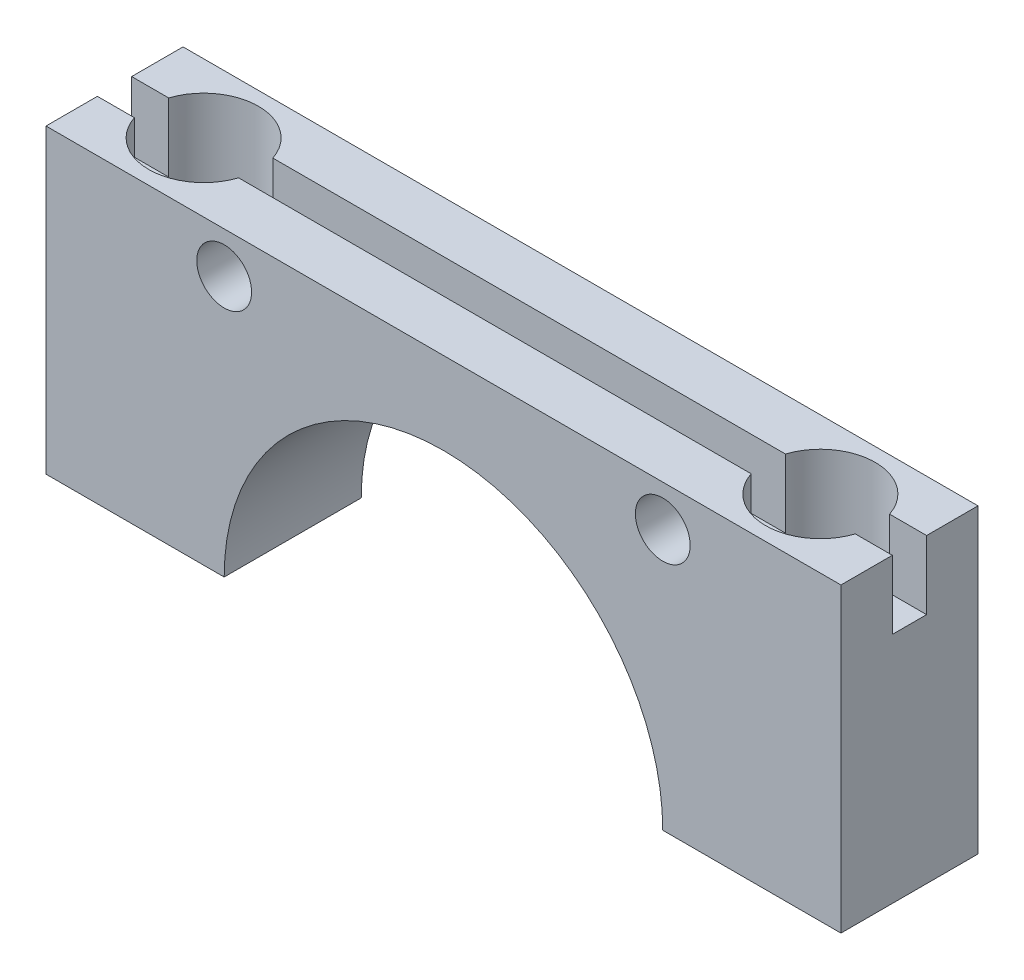
ISO-10303-21;
HEADER;
FILE_DESCRIPTION(('STEP AP214'),'2;1');
FILE_NAME('part.step','',(''),(''),'','','');
FILE_SCHEMA(('AUTOMOTIVE_DESIGN { 1 0 10303 214 1 1 1 1 }'));
ENDSEC;
DATA;
#1=APPLICATION_CONTEXT('core data for automotive mechanical design processes');
#2=APPLICATION_PROTOCOL_DEFINITION('international standard','automotive_design',2000,#1);
#3=PRODUCT_CONTEXT('',#1,'mechanical');
#4=PRODUCT('Part','Part','',(#3));
#5=PRODUCT_RELATED_PRODUCT_CATEGORY('part','',(#4));
#6=PRODUCT_DEFINITION_FORMATION('','',#4);
#7=PRODUCT_DEFINITION_CONTEXT('part definition',#1,'design');
#8=PRODUCT_DEFINITION('design','',#6,#7);
#9=PRODUCT_DEFINITION_SHAPE('','',#8);
#10=(LENGTH_UNIT() NAMED_UNIT(*) SI_UNIT(.MILLI.,.METRE.));
#11=(NAMED_UNIT(*) PLANE_ANGLE_UNIT() SI_UNIT($,.RADIAN.));
#12=(NAMED_UNIT(*) SI_UNIT($,.STERADIAN.) SOLID_ANGLE_UNIT());
#13=UNCERTAINTY_MEASURE_WITH_UNIT(LENGTH_MEASURE(1.E-05),#10,'distance_accuracy_value','');
#14=(GEOMETRIC_REPRESENTATION_CONTEXT(3) GLOBAL_UNCERTAINTY_ASSIGNED_CONTEXT((#13)) GLOBAL_UNIT_ASSIGNED_CONTEXT((#10,
#11,#12)) REPRESENTATION_CONTEXT('',''));
#15=CARTESIAN_POINT('',(0.,0.,0.));
#16=DIRECTION('',(0.,0.,1.));
#17=DIRECTION('',(1.,0.,0.));
#18=AXIS2_PLACEMENT_3D('',#15,#16,#17);
#19=CARTESIAN_POINT('',(-69.3342781396671,28.5744667064877,10.));
#20=DIRECTION('',(0.,-1.,0.));
#21=DIRECTION('',(0.,0.,-1.));
#22=AXIS2_PLACEMENT_3D('',#19,#20,#21);
#23=PLANE('',#22);
#24=DIRECTION('',(0.,0.,-1.));
#25=VECTOR('',#24,1.);
#26=CARTESIAN_POINT('',(-69.3342781396671,28.5744667064877,10.));
#27=LINE('',#26,#25);
#28=CARTESIAN_POINT('',(-69.3342781396671,28.5744667064877,3.75));
#29=VERTEX_POINT('',#28);
#30=CARTESIAN_POINT('',(-69.3342781396671,28.5744667064877,0.));
#31=VERTEX_POINT('',#30);
#32=EDGE_CURVE('E320',#29,#31,#27,.T.);
#33=ORIENTED_EDGE('',*,*,#32,.F.);
#34=DIRECTION('',(-1.,0.,0.));
#35=VECTOR('',#34,1.);
#36=CARTESIAN_POINT('',(-69.3342781396671,28.5744667064877,3.75));
#37=LINE('',#36,#35);
#38=CARTESIAN_POINT('',(-66.6339491780598,28.5744667064877,3.75));
#39=VERTEX_POINT('',#38);
#40=EDGE_CURVE('E365',#39,#29,#37,.T.);
#41=ORIENTED_EDGE('',*,*,#40,.F.);
#42=CARTESIAN_POINT('',(-62.8342781396671,28.5744667064877,5.));
#43=DIRECTION('',(0.,1.,0.));
#44=DIRECTION('',(0.,0.,1.));
#45=AXIS2_PLACEMENT_3D('',#42,#43,#44);
#46=CIRCLE('',#45,4.00000000000001);
#47=CARTESIAN_POINT('',(-59.0346071012744,28.5744667064877,3.75));
#48=VERTEX_POINT('',#47);
#49=EDGE_CURVE('E238',#48,#39,#46,.T.);
#50=ORIENTED_EDGE('',*,*,#49,.F.);
#51=CARTESIAN_POINT('',(-21.6339491780598,28.5744667064877,3.75));
#52=VERTEX_POINT('',#51);
#53=EDGE_CURVE('E369',#52,#48,#37,.T.);
#54=ORIENTED_EDGE('',*,*,#53,.F.);
#55=CARTESIAN_POINT('',(-17.8342781396671,28.5744667064877,5.));
#56=DIRECTION('',(0.,1.,0.));
#57=DIRECTION('',(0.,0.,1.));
#58=AXIS2_PLACEMENT_3D('',#55,#56,#57);
#59=CIRCLE('',#58,4.);
#60=CARTESIAN_POINT('',(-14.0346071012744,28.5744667064877,3.75));
#61=VERTEX_POINT('',#60);
#62=EDGE_CURVE('E247',#61,#52,#59,.T.);
#63=ORIENTED_EDGE('',*,*,#62,.F.);
#64=CARTESIAN_POINT('',(-11.3342781396671,28.5744667064877,3.75));
#65=VERTEX_POINT('',#64);
#66=EDGE_CURVE('E194',#65,#61,#37,.T.);
#67=ORIENTED_EDGE('',*,*,#66,.F.);
#68=DIRECTION('',(0.,0.,-1.));
#69=VECTOR('',#68,1.);
#70=CARTESIAN_POINT('',(-11.3342781396671,28.5744667064877,10.));
#71=LINE('',#70,#69);
#72=CARTESIAN_POINT('',(-11.3342781396671,28.5744667064877,0.));
#73=VERTEX_POINT('',#72);
#74=EDGE_CURVE('E281',#65,#73,#71,.T.);
#75=ORIENTED_EDGE('',*,*,#74,.T.);
#76=DIRECTION('',(-1.,0.,0.));
#77=VECTOR('',#76,1.);
#78=CARTESIAN_POINT('',(-69.3342781396671,28.5744667064877,0.));
#79=LINE('',#78,#77);
#80=EDGE_CURVE('E255',#73,#31,#79,.T.);
#81=ORIENTED_EDGE('',*,*,#80,.T.);
#82=EDGE_LOOP('',(#33,#41,#50,#54,#63,#67,#75,#81));
#83=FACE_BOUND('',#82,.T.);
#84=ADVANCED_FACE('F39',(#83),#23,.F.);
#85=CARTESIAN_POINT('',(-17.8342781396671,33.5744667064877,5.));
#86=DIRECTION('',(0.,-1.,0.));
#87=DIRECTION('',(0.,0.,-1.));
#88=AXIS2_PLACEMENT_3D('',#85,#86,#87);
#89=CYLINDRICAL_SURFACE('',#88,1.88);
#90=CARTESIAN_POINT('',(-17.8342781396671,6.57446670648769,5.));
#91=DIRECTION('',(0.,-1.,0.));
#92=DIRECTION('',(0.,0.,-1.));
#93=AXIS2_PLACEMENT_3D('',#90,#91,#92);
#94=CIRCLE('',#93,1.88);
#95=CARTESIAN_POINT('',(-17.8342781396671,6.57446670648769,3.12));
#96=VERTEX_POINT('',#95);
#97=EDGE_CURVE('E256',#96,#96,#94,.T.);
#98=ORIENTED_EDGE('',*,*,#97,.T.);
#99=EDGE_LOOP('',(#98));
#100=FACE_BOUND('',#99,.T.);
#101=CARTESIAN_POINT('',(-17.8342781396671,13.5744667064877,5.));
#102=DIRECTION('',(0.,1.,0.));
#103=DIRECTION('',(0.,0.,1.));
#104=AXIS2_PLACEMENT_3D('',#101,#102,#103);
#105=CIRCLE('',#104,1.88);
#106=CARTESIAN_POINT('',(-17.8342781396671,13.5744667064877,6.88));
#107=VERTEX_POINT('',#106);
#108=EDGE_CURVE('E260',#107,#107,#105,.F.);
#109=ORIENTED_EDGE('',*,*,#108,.F.);
#110=EDGE_LOOP('',(#109));
#111=FACE_BOUND('',#110,.T.);
#112=ADVANCED_FACE('F474',(#100,#111),#89,.F.);
#113=CARTESIAN_POINT('',(-62.8342781396671,33.5744667064877,5.));
#114=DIRECTION('',(0.,-1.,0.));
#115=DIRECTION('',(0.,0.,-1.));
#116=AXIS2_PLACEMENT_3D('',#113,#114,#115);
#117=CYLINDRICAL_SURFACE('',#116,1.8);
#118=CARTESIAN_POINT('',(-62.8342781396671,6.57446670648769,5.));
#119=DIRECTION('',(0.,-1.,0.));
#120=DIRECTION('',(0.,0.,-1.));
#121=AXIS2_PLACEMENT_3D('',#118,#119,#120);
#122=CIRCLE('',#121,1.8);
#123=CARTESIAN_POINT('',(-62.8342781396671,6.57446670648769,3.2));
#124=VERTEX_POINT('',#123);
#125=EDGE_CURVE('E251',#124,#124,#122,.T.);
#126=ORIENTED_EDGE('',*,*,#125,.T.);
#127=EDGE_LOOP('',(#126));
#128=FACE_BOUND('',#127,.T.);
#129=CARTESIAN_POINT('',(-62.8342781396671,13.5744667064877,5.));
#130=DIRECTION('',(0.,1.,0.));
#131=DIRECTION('',(0.,0.,1.));
#132=AXIS2_PLACEMENT_3D('',#129,#130,#131);
#133=CIRCLE('',#132,1.8);
#134=CARTESIAN_POINT('',(-62.8342781396671,13.5744667064877,6.8));
#135=VERTEX_POINT('',#134);
#136=EDGE_CURVE('E237',#135,#135,#133,.F.);
#137=ORIENTED_EDGE('',*,*,#136,.F.);
#138=EDGE_LOOP('',(#137));
#139=FACE_BOUND('',#138,.T.);
#140=ADVANCED_FACE('F478',(#128,#139),#117,.F.);
#141=CARTESIAN_POINT('',(-11.3342781396671,28.5744667064877,10.));
#142=VERTEX_POINT('',#141);
#143=CARTESIAN_POINT('',(-11.3342781396671,28.5744667064877,6.25));
#144=VERTEX_POINT('',#143);
#145=EDGE_CURVE('E300',#142,#144,#71,.T.);
#146=ORIENTED_EDGE('',*,*,#145,.T.);
#147=DIRECTION('',(1.,0.,0.));
#148=VECTOR('',#147,1.);
#149=CARTESIAN_POINT('',(-69.3342781396671,28.5744667064877,6.25));
#150=LINE('',#149,#148);
#151=CARTESIAN_POINT('',(-14.0346071012744,28.5744667064877,6.25));
#152=VERTEX_POINT('',#151);
#153=EDGE_CURVE('E350',#152,#144,#150,.T.);
#154=ORIENTED_EDGE('',*,*,#153,.F.);
#155=CARTESIAN_POINT('',(-21.6339491780598,28.5744667064877,6.25));
#156=VERTEX_POINT('',#155);
#157=EDGE_CURVE('E232',#156,#152,#59,.T.);
#158=ORIENTED_EDGE('',*,*,#157,.F.);
#159=CARTESIAN_POINT('',(-59.0346071012744,28.5744667064877,6.25));
#160=VERTEX_POINT('',#159);
#161=EDGE_CURVE('E366',#160,#156,#150,.T.);
#162=ORIENTED_EDGE('',*,*,#161,.F.);
#163=CARTESIAN_POINT('',(-66.6339491780598,28.5744667064877,6.25));
#164=VERTEX_POINT('',#163);
#165=EDGE_CURVE('E239',#164,#160,#46,.T.);
#166=ORIENTED_EDGE('',*,*,#165,.F.);
#167=CARTESIAN_POINT('',(-69.3342781396671,28.5744667064877,6.25));
#168=VERTEX_POINT('',#167);
#169=EDGE_CURVE('E362',#168,#164,#150,.T.);
#170=ORIENTED_EDGE('',*,*,#169,.F.);
#171=CARTESIAN_POINT('',(-69.3342781396671,28.5744667064877,10.));
#172=VERTEX_POINT('',#171);
#173=EDGE_CURVE('E199',#172,#168,#27,.T.);
#174=ORIENTED_EDGE('',*,*,#173,.F.);
#175=DIRECTION('',(-1.,0.,0.));
#176=VECTOR('',#175,1.);
#177=CARTESIAN_POINT('',(-69.3342781396671,28.5744667064877,10.));
#178=LINE('',#177,#176);
#179=EDGE_CURVE('E261',#142,#172,#178,.T.);
#180=ORIENTED_EDGE('',*,*,#179,.F.);
#181=EDGE_LOOP('',(#146,#154,#158,#162,#166,#170,#174,#180));
#182=FACE_BOUND('',#181,.T.);
#183=ADVANCED_FACE('F41',(#182),#23,.F.);
#184=CARTESIAN_POINT('',(-69.3342781396671,6.57446670648769,10.));
#185=DIRECTION('',(1.,0.,0.));
#186=DIRECTION('',(0.,0.,-1.));
#187=AXIS2_PLACEMENT_3D('',#184,#185,#186);
#188=PLANE('',#187);
#189=DIRECTION('',(0.,0.,1.));
#190=VECTOR('',#189,1.);
#191=CARTESIAN_POINT('',(-69.3342781396671,23.5744667064877,3.75));
#192=LINE('',#191,#190);
#193=CARTESIAN_POINT('',(-69.3342781396671,23.5744667064877,3.75));
#194=VERTEX_POINT('',#193);
#195=CARTESIAN_POINT('',(-69.3342781396671,23.5744667064877,6.25));
#196=VERTEX_POINT('',#195);
#197=EDGE_CURVE('E185',#194,#196,#192,.T.);
#198=ORIENTED_EDGE('',*,*,#197,.F.);
#199=DIRECTION('',(0.,1.,0.));
#200=VECTOR('',#199,1.);
#201=CARTESIAN_POINT('',(-69.3342781396671,23.5744667064877,3.75));
#202=LINE('',#201,#200);
#203=EDGE_CURVE('E217',#194,#29,#202,.T.);
#204=ORIENTED_EDGE('',*,*,#203,.T.);
#205=ORIENTED_EDGE('',*,*,#32,.T.);
#206=DIRECTION('',(0.,-1.,0.));
#207=VECTOR('',#206,1.);
#208=CARTESIAN_POINT('',(-69.3342781396671,6.57446670648769,0.));
#209=LINE('',#208,#207);
#210=CARTESIAN_POINT('',(-69.3342781396671,6.57446670648769,0.));
#211=VERTEX_POINT('',#210);
#212=EDGE_CURVE('E285',#31,#211,#209,.T.);
#213=ORIENTED_EDGE('',*,*,#212,.T.);
#214=DIRECTION('',(0.,0.,-1.));
#215=VECTOR('',#214,1.);
#216=CARTESIAN_POINT('',(-69.3342781396671,6.57446670648769,10.));
#217=LINE('',#216,#215);
#218=CARTESIAN_POINT('',(-69.3342781396671,6.57446670648769,10.));
#219=VERTEX_POINT('',#218);
#220=EDGE_CURVE('E316',#219,#211,#217,.T.);
#221=ORIENTED_EDGE('',*,*,#220,.F.);
#222=DIRECTION('',(0.,-1.,0.));
#223=VECTOR('',#222,1.);
#224=CARTESIAN_POINT('',(-69.3342781396671,6.57446670648769,10.));
#225=LINE('',#224,#223);
#226=EDGE_CURVE('E265',#172,#219,#225,.T.);
#227=ORIENTED_EDGE('',*,*,#226,.F.);
#228=ORIENTED_EDGE('',*,*,#173,.T.);
#229=DIRECTION('',(0.,1.,0.));
#230=VECTOR('',#229,1.);
#231=CARTESIAN_POINT('',(-69.3342781396671,23.5744667064877,6.25));
#232=LINE('',#231,#230);
#233=EDGE_CURVE('E173',#196,#168,#232,.T.);
#234=ORIENTED_EDGE('',*,*,#233,.F.);
#235=EDGE_LOOP('',(#198,#204,#205,#213,#221,#227,#228,#234));
#236=FACE_BOUND('',#235,.T.);
#237=ADVANCED_FACE('F197',(#236),#188,.F.);
#238=CARTESIAN_POINT('',(-69.3342781396671,6.57446670648769,10.));
#239=DIRECTION('',(0.,1.,0.));
#240=DIRECTION('',(0.,0.,1.));
#241=AXIS2_PLACEMENT_3D('',#238,#239,#240);
#242=PLANE('',#241);
#243=ORIENTED_EDGE('',*,*,#125,.F.);
#244=EDGE_LOOP('',(#243));
#245=FACE_BOUND('',#244,.T.);
#246=DIRECTION('',(1.,0.,0.));
#247=VECTOR('',#246,1.);
#248=CARTESIAN_POINT('',(-69.3342781396671,6.57446670648769,0.));
#249=LINE('',#248,#247);
#250=CARTESIAN_POINT('',(-56.3342781396671,6.57446670648769,0.));
#251=VERTEX_POINT('',#250);
#252=EDGE_CURVE('E288',#211,#251,#249,.T.);
#253=ORIENTED_EDGE('',*,*,#252,.T.);
#254=DIRECTION('',(0.,0.,-1.));
#255=VECTOR('',#254,1.);
#256=CARTESIAN_POINT('',(-56.3342781396671,6.57446670648769,10.));
#257=LINE('',#256,#255);
#258=CARTESIAN_POINT('',(-56.3342781396671,6.57446670648769,10.));
#259=VERTEX_POINT('',#258);
#260=EDGE_CURVE('E312',#259,#251,#257,.T.);
#261=ORIENTED_EDGE('',*,*,#260,.F.);
#262=DIRECTION('',(1.,0.,0.));
#263=VECTOR('',#262,1.);
#264=CARTESIAN_POINT('',(-69.3342781396671,6.57446670648769,10.));
#265=LINE('',#264,#263);
#266=EDGE_CURVE('E269',#219,#259,#265,.T.);
#267=ORIENTED_EDGE('',*,*,#266,.F.);
#268=ORIENTED_EDGE('',*,*,#220,.T.);
#269=EDGE_LOOP('',(#253,#261,#267,#268));
#270=FACE_BOUND('',#269,.T.);
#271=ADVANCED_FACE('F456',(#245,#270),#242,.F.);
#272=CARTESIAN_POINT('',(-40.3342781396671,6.57446670648769,10.));
#273=DIRECTION('',(0.,0.,-1.));
#274=DIRECTION('',(-1.,0.,0.));
#275=AXIS2_PLACEMENT_3D('',#272,#273,#274);
#276=CYLINDRICAL_SURFACE('',#275,16.);
#277=CARTESIAN_POINT('',(-40.3342781396671,6.57446670648769,0.));
#278=DIRECTION('',(0.,0.,-1.));
#279=DIRECTION('',(-1.,0.,0.));
#280=AXIS2_PLACEMENT_3D('',#277,#278,#279);
#281=CIRCLE('',#280,16.);
#282=CARTESIAN_POINT('',(-24.3342781396671,6.57446670648769,0.));
#283=VERTEX_POINT('',#282);
#284=EDGE_CURVE('E291',#251,#283,#281,.T.);
#285=ORIENTED_EDGE('',*,*,#284,.T.);
#286=DIRECTION('',(0.,0.,-1.));
#287=VECTOR('',#286,1.);
#288=CARTESIAN_POINT('',(-24.3342781396671,6.57446670648769,10.));
#289=LINE('',#288,#287);
#290=CARTESIAN_POINT('',(-24.3342781396671,6.57446670648769,10.));
#291=VERTEX_POINT('',#290);
#292=EDGE_CURVE('E308',#291,#283,#289,.T.);
#293=ORIENTED_EDGE('',*,*,#292,.F.);
#294=CARTESIAN_POINT('',(-40.3342781396671,6.57446670648769,10.));
#295=DIRECTION('',(0.,0.,-1.));
#296=DIRECTION('',(-1.,0.,0.));
#297=AXIS2_PLACEMENT_3D('',#294,#295,#296);
#298=CIRCLE('',#297,16.);
#299=EDGE_CURVE('E272',#259,#291,#298,.T.);
#300=ORIENTED_EDGE('',*,*,#299,.F.);
#301=ORIENTED_EDGE('',*,*,#260,.T.);
#302=EDGE_LOOP('',(#285,#293,#300,#301));
#303=FACE_BOUND('',#302,.T.);
#304=ADVANCED_FACE('F461',(#303),#276,.F.);
#305=CARTESIAN_POINT('',(-11.3342781396671,6.57446670648769,10.));
#306=DIRECTION('',(0.,1.,0.));
#307=DIRECTION('',(0.,0.,1.));
#308=AXIS2_PLACEMENT_3D('',#305,#306,#307);
#309=PLANE('',#308);
#310=ORIENTED_EDGE('',*,*,#97,.F.);
#311=EDGE_LOOP('',(#310));
#312=FACE_BOUND('',#311,.T.);
#313=DIRECTION('',(1.,0.,0.));
#314=VECTOR('',#313,1.);
#315=CARTESIAN_POINT('',(-11.3342781396671,6.57446670648769,0.));
#316=LINE('',#315,#314);
#317=CARTESIAN_POINT('',(-11.3342781396671,6.57446670648769,0.));
#318=VERTEX_POINT('',#317);
#319=EDGE_CURVE('E294',#283,#318,#316,.T.);
#320=ORIENTED_EDGE('',*,*,#319,.T.);
#321=DIRECTION('',(0.,0.,-1.));
#322=VECTOR('',#321,1.);
#323=CARTESIAN_POINT('',(-11.3342781396671,6.57446670648769,10.));
#324=LINE('',#323,#322);
#325=CARTESIAN_POINT('',(-11.3342781396671,6.57446670648769,10.));
#326=VERTEX_POINT('',#325);
#327=EDGE_CURVE('E304',#326,#318,#324,.T.);
#328=ORIENTED_EDGE('',*,*,#327,.F.);
#329=DIRECTION('',(1.,0.,0.));
#330=VECTOR('',#329,1.);
#331=CARTESIAN_POINT('',(-11.3342781396671,6.57446670648769,10.));
#332=LINE('',#331,#330);
#333=EDGE_CURVE('E275',#291,#326,#332,.T.);
#334=ORIENTED_EDGE('',*,*,#333,.F.);
#335=ORIENTED_EDGE('',*,*,#292,.T.);
#336=EDGE_LOOP('',(#320,#328,#334,#335));
#337=FACE_BOUND('',#336,.T.);
#338=ADVANCED_FACE('F462',(#312,#337),#309,.F.);
#339=CARTESIAN_POINT('',(-11.3342781396671,28.5744667064877,10.));
#340=DIRECTION('',(-1.,0.,0.));
#341=DIRECTION('',(0.,0.,1.));
#342=AXIS2_PLACEMENT_3D('',#339,#340,#341);
#343=PLANE('',#342);
#344=ORIENTED_EDGE('',*,*,#74,.F.);
#345=DIRECTION('',(0.,1.,0.));
#346=VECTOR('',#345,1.);
#347=CARTESIAN_POINT('',(-11.3342781396671,23.5744667064877,3.75));
#348=LINE('',#347,#346);
#349=CARTESIAN_POINT('',(-11.3342781396671,23.5744667064877,3.75));
#350=VERTEX_POINT('',#349);
#351=EDGE_CURVE('E207',#350,#65,#348,.T.);
#352=ORIENTED_EDGE('',*,*,#351,.F.);
#353=DIRECTION('',(0.,0.,-1.));
#354=VECTOR('',#353,1.);
#355=CARTESIAN_POINT('',(-11.3342781396671,23.5744667064877,3.75));
#356=LINE('',#355,#354);
#357=CARTESIAN_POINT('',(-11.3342781396671,23.5744667064877,6.25));
#358=VERTEX_POINT('',#357);
#359=EDGE_CURVE('E180',#358,#350,#356,.T.);
#360=ORIENTED_EDGE('',*,*,#359,.F.);
#361=DIRECTION('',(0.,1.,0.));
#362=VECTOR('',#361,1.);
#363=CARTESIAN_POINT('',(-11.3342781396671,23.5744667064877,6.25));
#364=LINE('',#363,#362);
#365=EDGE_CURVE('E201',#358,#144,#364,.T.);
#366=ORIENTED_EDGE('',*,*,#365,.T.);
#367=ORIENTED_EDGE('',*,*,#145,.F.);
#368=DIRECTION('',(0.,1.,0.));
#369=VECTOR('',#368,1.);
#370=CARTESIAN_POINT('',(-11.3342781396671,28.5744667064877,10.));
#371=LINE('',#370,#369);
#372=EDGE_CURVE('E278',#326,#142,#371,.T.);
#373=ORIENTED_EDGE('',*,*,#372,.F.);
#374=ORIENTED_EDGE('',*,*,#327,.T.);
#375=DIRECTION('',(0.,1.,0.));
#376=VECTOR('',#375,1.);
#377=CARTESIAN_POINT('',(-11.3342781396671,28.5744667064877,0.));
#378=LINE('',#377,#376);
#379=EDGE_CURVE('E266',#318,#73,#378,.T.);
#380=ORIENTED_EDGE('',*,*,#379,.T.);
#381=EDGE_LOOP('',(#344,#352,#360,#366,#367,#373,#374,#380));
#382=FACE_BOUND('',#381,.T.);
#383=ADVANCED_FACE('F386',(#382),#343,.F.);
#384=CARTESIAN_POINT('',(-40.3342781396671,6.57446670648769,10.));
#385=DIRECTION('',(0.,0.,-1.));
#386=DIRECTION('',(-1.,0.,0.));
#387=AXIS2_PLACEMENT_3D('',#384,#385,#386);
#388=PLANE('',#387);
#389=CARTESIAN_POINT('',(-56.3342781396671,25.5744667064877,10.));
#390=DIRECTION('',(0.,0.,1.));
#391=DIRECTION('',(1.,0.,0.));
#392=AXIS2_PLACEMENT_3D('',#389,#390,#391);
#393=CIRCLE('',#392,2.);
#394=CARTESIAN_POINT('',(-54.3342781396671,25.5744667064877,10.));
#395=VERTEX_POINT('',#394);
#396=EDGE_CURVE('E344',#395,#395,#393,.T.);
#397=ORIENTED_EDGE('',*,*,#396,.F.);
#398=EDGE_LOOP('',(#397));
#399=FACE_BOUND('',#398,.T.);
#400=CARTESIAN_POINT('',(-24.3342781396671,25.5744667064877,10.));
#401=DIRECTION('',(0.,0.,1.));
#402=DIRECTION('',(1.,0.,0.));
#403=AXIS2_PLACEMENT_3D('',#400,#401,#402);
#404=CIRCLE('',#403,2.);
#405=CARTESIAN_POINT('',(-22.3342781396671,25.5744667064877,10.));
#406=VERTEX_POINT('',#405);
#407=EDGE_CURVE('E352',#406,#406,#404,.T.);
#408=ORIENTED_EDGE('',*,*,#407,.F.);
#409=EDGE_LOOP('',(#408));
#410=FACE_BOUND('',#409,.T.);
#411=ORIENTED_EDGE('',*,*,#179,.T.);
#412=ORIENTED_EDGE('',*,*,#226,.T.);
#413=ORIENTED_EDGE('',*,*,#266,.T.);
#414=ORIENTED_EDGE('',*,*,#299,.T.);
#415=ORIENTED_EDGE('',*,*,#333,.T.);
#416=ORIENTED_EDGE('',*,*,#372,.T.);
#417=EDGE_LOOP('',(#411,#412,#413,#414,#415,#416));
#418=FACE_BOUND('',#417,.T.);
#419=ADVANCED_FACE('F443',(#399,#410,#418),#388,.F.);
#420=CARTESIAN_POINT('',(-40.3342781396671,6.57446670648769,0.));
#421=DIRECTION('',(0.,0.,-1.));
#422=DIRECTION('',(-1.,0.,0.));
#423=AXIS2_PLACEMENT_3D('',#420,#421,#422);
#424=PLANE('',#423);
#425=ORIENTED_EDGE('',*,*,#80,.F.);
#426=ORIENTED_EDGE('',*,*,#379,.F.);
#427=ORIENTED_EDGE('',*,*,#319,.F.);
#428=ORIENTED_EDGE('',*,*,#284,.F.);
#429=ORIENTED_EDGE('',*,*,#252,.F.);
#430=ORIENTED_EDGE('',*,*,#212,.F.);
#431=EDGE_LOOP('',(#425,#426,#427,#428,#429,#430));
#432=FACE_BOUND('',#431,.T.);
#433=ADVANCED_FACE('F450',(#432),#424,.T.);
#434=CARTESIAN_POINT('',(-62.8342781396671,13.5744667064877,5.));
#435=DIRECTION('',(0.,1.,0.));
#436=DIRECTION('',(0.,0.,1.));
#437=AXIS2_PLACEMENT_3D('',#434,#435,#436);
#438=PLANE('',#437);
#439=CARTESIAN_POINT('',(-62.8342781396671,13.5744667064877,5.));
#440=DIRECTION('',(0.,1.,0.));
#441=DIRECTION('',(0.,0.,1.));
#442=AXIS2_PLACEMENT_3D('',#439,#440,#441);
#443=CIRCLE('',#442,4.00000000000001);
#444=CARTESIAN_POINT('',(-62.8342781396671,13.5744667064877,9.00000000000001));
#445=VERTEX_POINT('',#444);
#446=EDGE_CURVE('E233',#445,#445,#443,.T.);
#447=ORIENTED_EDGE('',*,*,#446,.T.);
#448=EDGE_LOOP('',(#447));
#449=FACE_BOUND('',#448,.T.);
#450=ORIENTED_EDGE('',*,*,#136,.T.);
#451=EDGE_LOOP('',(#450));
#452=FACE_BOUND('',#451,.T.);
#453=ADVANCED_FACE('F498',(#449,#452),#438,.T.);
#454=CARTESIAN_POINT('',(-62.8342781396671,13.5744667064877,5.));
#455=DIRECTION('',(0.,1.,0.));
#456=DIRECTION('',(0.,0.,1.));
#457=AXIS2_PLACEMENT_3D('',#454,#455,#456);
#458=CYLINDRICAL_SURFACE('',#457,4.00000000000001);
#459=ORIENTED_EDGE('',*,*,#49,.T.);
#460=DIRECTION('',(0.,1.,0.));
#461=VECTOR('',#460,1.);
#462=CARTESIAN_POINT('',(-66.6339491780598,13.5744667064877,3.75));
#463=LINE('',#462,#461);
#464=CARTESIAN_POINT('',(-66.6339491780598,23.5744667064877,3.75));
#465=VERTEX_POINT('',#464);
#466=EDGE_CURVE('E228',#39,#465,#463,.F.);
#467=ORIENTED_EDGE('',*,*,#466,.T.);
#468=CARTESIAN_POINT('',(-62.8342781396671,23.5744667064877,5.));
#469=DIRECTION('',(0.,1.,0.));
#470=DIRECTION('',(0.,0.,1.));
#471=AXIS2_PLACEMENT_3D('',#468,#469,#470);
#472=CIRCLE('',#471,4.00000000000001);
#473=CARTESIAN_POINT('',(-66.6339491780598,23.5744667064877,6.25));
#474=VERTEX_POINT('',#473);
#475=EDGE_CURVE('E216',#474,#465,#472,.F.);
#476=ORIENTED_EDGE('',*,*,#475,.F.);
#477=DIRECTION('',(0.,1.,0.));
#478=VECTOR('',#477,1.);
#479=CARTESIAN_POINT('',(-66.6339491780598,13.5744667064877,6.25));
#480=LINE('',#479,#478);
#481=EDGE_CURVE('E176',#474,#164,#480,.T.);
#482=ORIENTED_EDGE('',*,*,#481,.T.);
#483=ORIENTED_EDGE('',*,*,#165,.T.);
#484=DIRECTION('',(0.,1.,0.));
#485=VECTOR('',#484,1.);
#486=CARTESIAN_POINT('',(-59.0346071012744,13.5744667064877,6.25));
#487=LINE('',#486,#485);
#488=CARTESIAN_POINT('',(-59.0346071012744,23.5744667064877,6.25));
#489=VERTEX_POINT('',#488);
#490=EDGE_CURVE('E220',#160,#489,#487,.F.);
#491=ORIENTED_EDGE('',*,*,#490,.T.);
#492=CARTESIAN_POINT('',(-59.0346071012744,23.5744667064877,3.75));
#493=VERTEX_POINT('',#492);
#494=EDGE_CURVE('E213',#493,#489,#472,.F.);
#495=ORIENTED_EDGE('',*,*,#494,.F.);
#496=DIRECTION('',(0.,1.,0.));
#497=VECTOR('',#496,1.);
#498=CARTESIAN_POINT('',(-59.0346071012744,13.5744667064877,3.75));
#499=LINE('',#498,#497);
#500=EDGE_CURVE('E224',#493,#48,#499,.T.);
#501=ORIENTED_EDGE('',*,*,#500,.T.);
#502=EDGE_LOOP('',(#459,#467,#476,#482,#483,#491,#495,#501));
#503=FACE_BOUND('',#502,.T.);
#504=ORIENTED_EDGE('',*,*,#446,.F.);
#505=EDGE_LOOP('',(#504));
#506=FACE_BOUND('',#505,.T.);
#507=ADVANCED_FACE('F399',(#503,#506),#458,.F.);
#508=CARTESIAN_POINT('',(-17.8342781396671,13.5744667064877,5.));
#509=DIRECTION('',(0.,1.,0.));
#510=DIRECTION('',(0.,0.,1.));
#511=AXIS2_PLACEMENT_3D('',#508,#509,#510);
#512=PLANE('',#511);
#513=CARTESIAN_POINT('',(-17.8342781396671,13.5744667064877,5.));
#514=DIRECTION('',(0.,1.,0.));
#515=DIRECTION('',(0.,0.,1.));
#516=AXIS2_PLACEMENT_3D('',#513,#514,#515);
#517=CIRCLE('',#516,4.);
#518=CARTESIAN_POINT('',(-17.8342781396671,13.5744667064877,9.));
#519=VERTEX_POINT('',#518);
#520=EDGE_CURVE('E243',#519,#519,#517,.T.);
#521=ORIENTED_EDGE('',*,*,#520,.T.);
#522=EDGE_LOOP('',(#521));
#523=FACE_BOUND('',#522,.T.);
#524=ORIENTED_EDGE('',*,*,#108,.T.);
#525=EDGE_LOOP('',(#524));
#526=FACE_BOUND('',#525,.T.);
#527=ADVANCED_FACE('F507',(#523,#526),#512,.T.);
#528=CARTESIAN_POINT('',(-17.8342781396671,13.5744667064877,5.));
#529=DIRECTION('',(0.,1.,0.));
#530=DIRECTION('',(0.,0.,1.));
#531=AXIS2_PLACEMENT_3D('',#528,#529,#530);
#532=CYLINDRICAL_SURFACE('',#531,4.);
#533=ORIENTED_EDGE('',*,*,#62,.T.);
#534=DIRECTION('',(0.,1.,0.));
#535=VECTOR('',#534,1.);
#536=CARTESIAN_POINT('',(-21.6339491780598,13.5744667064877,3.75));
#537=LINE('',#536,#535);
#538=CARTESIAN_POINT('',(-21.6339491780598,23.5744667064877,3.75));
#539=VERTEX_POINT('',#538);
#540=EDGE_CURVE('E11',#52,#539,#537,.F.);
#541=ORIENTED_EDGE('',*,*,#540,.T.);
#542=CARTESIAN_POINT('',(-17.8342781396671,23.5744667064877,5.));
#543=DIRECTION('',(0.,1.,0.));
#544=DIRECTION('',(0.,0.,1.));
#545=AXIS2_PLACEMENT_3D('',#542,#543,#544);
#546=CIRCLE('',#545,4.);
#547=CARTESIAN_POINT('',(-21.6339491780598,23.5744667064877,6.25));
#548=VERTEX_POINT('',#547);
#549=EDGE_CURVE('E333',#548,#539,#546,.F.);
#550=ORIENTED_EDGE('',*,*,#549,.F.);
#551=DIRECTION('',(0.,1.,0.));
#552=VECTOR('',#551,1.);
#553=CARTESIAN_POINT('',(-21.6339491780598,13.5744667064877,6.25));
#554=LINE('',#553,#552);
#555=EDGE_CURVE('E49',#548,#156,#554,.T.);
#556=ORIENTED_EDGE('',*,*,#555,.T.);
#557=ORIENTED_EDGE('',*,*,#157,.T.);
#558=DIRECTION('',(0.,1.,0.));
#559=VECTOR('',#558,1.);
#560=CARTESIAN_POINT('',(-14.0346071012744,13.5744667064877,6.25));
#561=LINE('',#560,#559);
#562=CARTESIAN_POINT('',(-14.0346071012744,23.5744667064877,6.25));
#563=VERTEX_POINT('',#562);
#564=EDGE_CURVE('E332',#152,#563,#561,.F.);
#565=ORIENTED_EDGE('',*,*,#564,.T.);
#566=CARTESIAN_POINT('',(-14.0346071012744,23.5744667064877,3.75));
#567=VERTEX_POINT('',#566);
#568=EDGE_CURVE('E323',#567,#563,#546,.F.);
#569=ORIENTED_EDGE('',*,*,#568,.F.);
#570=DIRECTION('',(0.,1.,0.));
#571=VECTOR('',#570,1.);
#572=CARTESIAN_POINT('',(-14.0346071012744,13.5744667064877,3.75));
#573=LINE('',#572,#571);
#574=EDGE_CURVE('E337',#567,#61,#573,.T.);
#575=ORIENTED_EDGE('',*,*,#574,.T.);
#576=EDGE_LOOP('',(#533,#541,#550,#556,#557,#565,#569,#575));
#577=FACE_BOUND('',#576,.T.);
#578=ORIENTED_EDGE('',*,*,#520,.F.);
#579=EDGE_LOOP('',(#578));
#580=FACE_BOUND('',#579,.T.);
#581=ADVANCED_FACE('F411',(#577,#580),#532,.F.);
#582=CARTESIAN_POINT('',(0.,23.5744667064877,0.));
#583=DIRECTION('',(0.,1.,0.));
#584=DIRECTION('',(0.,0.,1.));
#585=AXIS2_PLACEMENT_3D('',#582,#583,#584);
#586=PLANE('',#585);
#587=ORIENTED_EDGE('',*,*,#568,.T.);
#588=DIRECTION('',(1.,0.,0.));
#589=VECTOR('',#588,1.);
#590=CARTESIAN_POINT('',(-69.3342781396671,23.5744667064877,6.25));
#591=LINE('',#590,#589);
#592=EDGE_CURVE('E193',#563,#358,#591,.T.);
#593=ORIENTED_EDGE('',*,*,#592,.T.);
#594=ORIENTED_EDGE('',*,*,#359,.T.);
#595=DIRECTION('',(-1.,0.,0.));
#596=VECTOR('',#595,1.);
#597=CARTESIAN_POINT('',(-69.3342781396671,23.5744667064877,3.75));
#598=LINE('',#597,#596);
#599=EDGE_CURVE('E202',#350,#567,#598,.T.);
#600=ORIENTED_EDGE('',*,*,#599,.T.);
#601=EDGE_LOOP('',(#587,#593,#594,#600));
#602=FACE_BOUND('',#601,.T.);
#603=ADVANCED_FACE('F416',(#602),#586,.T.);
#604=CARTESIAN_POINT('',(-69.3342781396671,23.5744667064877,6.25));
#605=DIRECTION('',(0.,0.,1.));
#606=DIRECTION('',(1.,0.,0.));
#607=AXIS2_PLACEMENT_3D('',#604,#605,#606);
#608=PLANE('',#607);
#609=ORIENTED_EDGE('',*,*,#153,.T.);
#610=ORIENTED_EDGE('',*,*,#365,.F.);
#611=ORIENTED_EDGE('',*,*,#592,.F.);
#612=ORIENTED_EDGE('',*,*,#564,.F.);
#613=EDGE_LOOP('',(#609,#610,#611,#612));
#614=FACE_BOUND('',#613,.T.);
#615=ADVANCED_FACE('F419',(#614),#608,.F.);
#616=CARTESIAN_POINT('',(-69.3342781396671,23.5744667064877,3.75));
#617=DIRECTION('',(0.,0.,-1.));
#618=DIRECTION('',(-1.,0.,0.));
#619=AXIS2_PLACEMENT_3D('',#616,#617,#618);
#620=PLANE('',#619);
#621=ORIENTED_EDGE('',*,*,#599,.F.);
#622=ORIENTED_EDGE('',*,*,#351,.T.);
#623=ORIENTED_EDGE('',*,*,#66,.T.);
#624=ORIENTED_EDGE('',*,*,#574,.F.);
#625=EDGE_LOOP('',(#621,#622,#623,#624));
#626=FACE_BOUND('',#625,.T.);
#627=ADVANCED_FACE('F376',(#626),#620,.F.);
#628=CARTESIAN_POINT('',(-56.3342781396671,23.5744667064877,6.25));
#629=VERTEX_POINT('',#628);
#630=EDGE_CURVE('E181',#489,#629,#591,.T.);
#631=ORIENTED_EDGE('',*,*,#630,.T.);
#632=CARTESIAN_POINT('',(-24.3342781396671,23.5744667064877,6.25));
#633=VERTEX_POINT('',#632);
#634=EDGE_CURVE('E422',#629,#633,#591,.T.);
#635=ORIENTED_EDGE('',*,*,#634,.T.);
#636=EDGE_CURVE('E183',#633,#548,#591,.T.);
#637=ORIENTED_EDGE('',*,*,#636,.T.);
#638=ORIENTED_EDGE('',*,*,#549,.T.);
#639=EDGE_CURVE('E209',#539,#493,#598,.T.);
#640=ORIENTED_EDGE('',*,*,#639,.T.);
#641=ORIENTED_EDGE('',*,*,#494,.T.);
#642=EDGE_LOOP('',(#631,#635,#637,#638,#640,#641));
#643=FACE_BOUND('',#642,.T.);
#644=ADVANCED_FACE('F429',(#643),#586,.T.);
#645=ORIENTED_EDGE('',*,*,#634,.F.);
#646=CARTESIAN_POINT('',(-56.3342781396671,25.5744667064877,6.25));
#647=DIRECTION('',(0.,0.,1.));
#648=DIRECTION('',(1.,0.,0.));
#649=AXIS2_PLACEMENT_3D('',#646,#647,#648);
#650=CIRCLE('',#649,2.);
#651=EDGE_CURVE('E43',#629,#629,#650,.T.);
#652=ORIENTED_EDGE('',*,*,#651,.T.);
#653=ORIENTED_EDGE('',*,*,#630,.F.);
#654=ORIENTED_EDGE('',*,*,#490,.F.);
#655=ORIENTED_EDGE('',*,*,#161,.T.);
#656=ORIENTED_EDGE('',*,*,#555,.F.);
#657=ORIENTED_EDGE('',*,*,#636,.F.);
#658=CARTESIAN_POINT('',(-24.3342781396671,25.5744667064877,6.25));
#659=DIRECTION('',(0.,0.,1.));
#660=DIRECTION('',(1.,0.,0.));
#661=AXIS2_PLACEMENT_3D('',#658,#659,#660);
#662=CIRCLE('',#661,2.);
#663=EDGE_CURVE('E55',#633,#633,#662,.T.);
#664=ORIENTED_EDGE('',*,*,#663,.T.);
#665=EDGE_LOOP('',(#645,#652,#653,#654,#655,#656,#657,#664));
#666=FACE_BOUND('',#665,.T.);
#667=ADVANCED_FACE('F432',(#666),#608,.F.);
#668=ORIENTED_EDGE('',*,*,#639,.F.);
#669=ORIENTED_EDGE('',*,*,#540,.F.);
#670=ORIENTED_EDGE('',*,*,#53,.T.);
#671=ORIENTED_EDGE('',*,*,#500,.F.);
#672=EDGE_LOOP('',(#668,#669,#670,#671));
#673=FACE_BOUND('',#672,.T.);
#674=ADVANCED_FACE('F407',(#673),#620,.F.);
#675=ORIENTED_EDGE('',*,*,#40,.T.);
#676=ORIENTED_EDGE('',*,*,#203,.F.);
#677=EDGE_CURVE('E188',#465,#194,#598,.T.);
#678=ORIENTED_EDGE('',*,*,#677,.F.);
#679=ORIENTED_EDGE('',*,*,#466,.F.);
#680=EDGE_LOOP('',(#675,#676,#678,#679));
#681=FACE_BOUND('',#680,.T.);
#682=ADVANCED_FACE('F396',(#681),#620,.F.);
#683=EDGE_CURVE('E169',#196,#474,#591,.T.);
#684=ORIENTED_EDGE('',*,*,#683,.F.);
#685=ORIENTED_EDGE('',*,*,#233,.T.);
#686=ORIENTED_EDGE('',*,*,#169,.T.);
#687=ORIENTED_EDGE('',*,*,#481,.F.);
#688=EDGE_LOOP('',(#684,#685,#686,#687));
#689=FACE_BOUND('',#688,.T.);
#690=ADVANCED_FACE('F171',(#689),#608,.F.);
#691=ORIENTED_EDGE('',*,*,#475,.T.);
#692=ORIENTED_EDGE('',*,*,#677,.T.);
#693=ORIENTED_EDGE('',*,*,#197,.T.);
#694=ORIENTED_EDGE('',*,*,#683,.T.);
#695=EDGE_LOOP('',(#691,#692,#693,#694));
#696=FACE_BOUND('',#695,.T.);
#697=ADVANCED_FACE('F186',(#696),#586,.T.);
#698=CARTESIAN_POINT('',(-24.3342781396671,25.5744667064877,5.));
#699=DIRECTION('',(0.,0.,1.));
#700=DIRECTION('',(1.,0.,0.));
#701=AXIS2_PLACEMENT_3D('',#698,#699,#700);
#702=CYLINDRICAL_SURFACE('',#701,2.);
#703=ORIENTED_EDGE('',*,*,#407,.T.);
#704=EDGE_LOOP('',(#703));
#705=FACE_BOUND('',#704,.T.);
#706=ORIENTED_EDGE('',*,*,#663,.F.);
#707=EDGE_LOOP('',(#706));
#708=FACE_BOUND('',#707,.T.);
#709=ADVANCED_FACE('F530',(#705,#708),#702,.F.);
#710=CARTESIAN_POINT('',(-56.3342781396671,25.5744667064877,5.));
#711=DIRECTION('',(0.,0.,1.));
#712=DIRECTION('',(1.,0.,0.));
#713=AXIS2_PLACEMENT_3D('',#710,#711,#712);
#714=CYLINDRICAL_SURFACE('',#713,2.);
#715=ORIENTED_EDGE('',*,*,#396,.T.);
#716=EDGE_LOOP('',(#715));
#717=FACE_BOUND('',#716,.T.);
#718=ORIENTED_EDGE('',*,*,#651,.F.);
#719=EDGE_LOOP('',(#718));
#720=FACE_BOUND('',#719,.T.);
#721=ADVANCED_FACE('F564',(#717,#720),#714,.F.);
#722=CLOSED_SHELL('',(#84,#112,#140,#183,#237,#271,#304,#338,#383,#419,#433,#453,#507,#527,#581,
#603,#615,#627,#644,#667,#674,#682,#690,#697,#709,#721));
#723=MANIFOLD_SOLID_BREP('B2',#722);
#724=ADVANCED_BREP_SHAPE_REPRESENTATION('',(#18,#723),#14);
#725=SHAPE_DEFINITION_REPRESENTATION(#9,#724);
ENDSEC;
END-ISO-10303-21;
